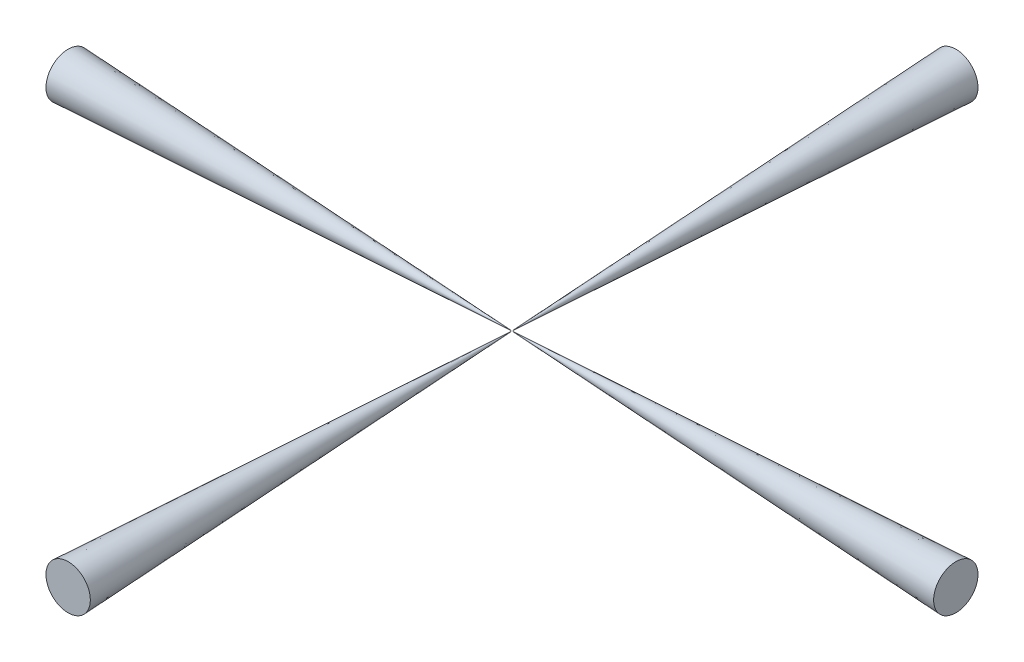
ISO-10303-21;
HEADER;
FILE_DESCRIPTION(('STEP AP214'),'2;1');
FILE_NAME('part.step','',(''),(''),'','','');
FILE_SCHEMA(('AUTOMOTIVE_DESIGN { 1 0 10303 214 1 1 1 1 }'));
ENDSEC;
DATA;
#1=APPLICATION_CONTEXT('core data for automotive mechanical design processes');
#2=APPLICATION_PROTOCOL_DEFINITION('international standard','automotive_design',2000,#1);
#3=PRODUCT_CONTEXT('',#1,'mechanical');
#4=PRODUCT('Part','Part','',(#3));
#5=PRODUCT_RELATED_PRODUCT_CATEGORY('part','',(#4));
#6=PRODUCT_DEFINITION_FORMATION('','',#4);
#7=PRODUCT_DEFINITION_CONTEXT('part definition',#1,'design');
#8=PRODUCT_DEFINITION('design','',#6,#7);
#9=PRODUCT_DEFINITION_SHAPE('','',#8);
#10=(LENGTH_UNIT() NAMED_UNIT(*) SI_UNIT(.MILLI.,.METRE.));
#11=(NAMED_UNIT(*) PLANE_ANGLE_UNIT() SI_UNIT($,.RADIAN.));
#12=(NAMED_UNIT(*) SI_UNIT($,.STERADIAN.) SOLID_ANGLE_UNIT());
#13=UNCERTAINTY_MEASURE_WITH_UNIT(LENGTH_MEASURE(1.E-05),#10,'distance_accuracy_value','');
#14=(GEOMETRIC_REPRESENTATION_CONTEXT(3) GLOBAL_UNCERTAINTY_ASSIGNED_CONTEXT((#13)) GLOBAL_UNIT_ASSIGNED_CONTEXT((#10,
#11,#12)) REPRESENTATION_CONTEXT('',''));
#15=CARTESIAN_POINT('',(0.,0.,0.));
#16=DIRECTION('',(0.,0.,1.));
#17=DIRECTION('',(1.,0.,0.));
#18=AXIS2_PLACEMENT_3D('',#15,#16,#17);
#19=CARTESIAN_POINT('',(-6.7381823802494E-13,0.,200.));
#20=DIRECTION('',(0.,0.,1.));
#21=DIRECTION('',(1.,0.,0.));
#22=AXIS2_PLACEMENT_3D('',#19,#20,#21);
#23=CONICAL_SURFACE('',#22,9.99999999999998,0.0498960513880323);
#24=CARTESIAN_POINT('',(0.,0.,0.));
#25=DIRECTION('',(0.,0.,1.));
#26=DIRECTION('',(1.,0.,0.));
#27=AXIS2_PLACEMENT_3D('',#24,#25,#26);
#28=CIRCLE('',#27,0.0125);
#29=CARTESIAN_POINT('',(0.0125000000000004,0.,0.));
#30=VERTEX_POINT('',#29);
#31=EDGE_CURVE('E48',#30,#30,#28,.T.);
#32=CARTESIAN_POINT('',(-6.7381823802494E-13,0.,200.));
#33=DIRECTION('',(0.,0.,1.));
#34=DIRECTION('',(1.,0.,0.));
#35=AXIS2_PLACEMENT_3D('',#32,#33,#34);
#36=CIRCLE('',#35,9.99999999999998);
#37=CARTESIAN_POINT('',(9.9999999999993,0.,200.));
#38=VERTEX_POINT('',#37);
#39=EDGE_CURVE('E11',#38,#38,#36,.T.);
#40=CARTESIAN_POINT('',(0.0125000000000004,0.,0.));
#41=CARTESIAN_POINT('',(0.116536458333326,0.,2.08333333333334));
#42=CARTESIAN_POINT('',(0.220572916666653,0.,4.16666666666667));
#43=CARTESIAN_POINT('',(0.428645833333305,0.,8.33333333333334));
#44=CARTESIAN_POINT('',(0.532682291666631,0.,10.4166666666667));
#45=CARTESIAN_POINT('',(0.740755208333283,0.,14.5833333333333));
#46=CARTESIAN_POINT('',(0.844791666666608,0.,16.6666666666667));
#47=CARTESIAN_POINT('',(1.05286458333326,0.,20.8333333333333));
#48=CARTESIAN_POINT('',(1.15690104166659,0.,22.9166666666667));
#49=CARTESIAN_POINT('',(1.36497395833324,0.,27.0833333333333));
#50=CARTESIAN_POINT('',(1.46901041666656,0.,29.1666666666667));
#51=CARTESIAN_POINT('',(1.67708333333322,0.,33.3333333333333));
#52=CARTESIAN_POINT('',(1.78111979166654,0.,35.4166666666667));
#53=CARTESIAN_POINT('',(1.9891927083332,0.,39.5833333333333));
#54=CARTESIAN_POINT('',(2.09322916666652,0.,41.6666666666667));
#55=CARTESIAN_POINT('',(2.30130208333317,0.,45.8333333333333));
#56=CARTESIAN_POINT('',(2.4053385416665,0.,47.9166666666667));
#57=CARTESIAN_POINT('',(2.61341145833315,0.,52.0833333333333));
#58=CARTESIAN_POINT('',(2.71744791666648,0.,54.1666666666667));
#59=CARTESIAN_POINT('',(2.92552083333313,0.,58.3333333333333));
#60=CARTESIAN_POINT('',(3.02955729166646,0.,60.4166666666667));
#61=CARTESIAN_POINT('',(3.23763020833311,0.,64.5833333333333));
#62=CARTESIAN_POINT('',(3.34166666666643,0.,66.6666666666667));
#63=CARTESIAN_POINT('',(3.54973958333309,0.,70.8333333333333));
#64=CARTESIAN_POINT('',(3.65377604166641,0.,72.9166666666667));
#65=CARTESIAN_POINT('',(3.86184895833306,0.,77.0833333333333));
#66=CARTESIAN_POINT('',(3.96588541666639,0.,79.1666666666667));
#67=CARTESIAN_POINT('',(4.17395833333304,0.,83.3333333333333));
#68=CARTESIAN_POINT('',(4.27799479166637,0.,85.4166666666667));
#69=CARTESIAN_POINT('',(4.48606770833302,0.,89.5833333333334));
#70=CARTESIAN_POINT('',(4.59010416666635,0.,91.6666666666667));
#71=CARTESIAN_POINT('',(4.798177083333,0.,95.8333333333334));
#72=CARTESIAN_POINT('',(4.90221354166632,0.,97.9166666666667));
#73=CARTESIAN_POINT('',(5.11028645833298,0.,102.083333333333));
#74=CARTESIAN_POINT('',(5.2143229166663,0.,104.166666666667));
#75=CARTESIAN_POINT('',(5.42239583333296,0.,108.333333333333));
#76=CARTESIAN_POINT('',(5.52643229166628,0.,110.416666666667));
#77=CARTESIAN_POINT('',(5.73450520833293,0.,114.583333333333));
#78=CARTESIAN_POINT('',(5.83854166666626,0.,116.666666666667));
#79=CARTESIAN_POINT('',(6.04661458333291,0.,120.833333333333));
#80=CARTESIAN_POINT('',(6.15065104166624,0.,122.916666666667));
#81=CARTESIAN_POINT('',(6.35872395833289,0.,127.083333333333));
#82=CARTESIAN_POINT('',(6.46276041666621,0.,129.166666666667));
#83=CARTESIAN_POINT('',(6.67083333333287,0.,133.333333333333));
#84=CARTESIAN_POINT('',(6.77486979166619,0.,135.416666666667));
#85=CARTESIAN_POINT('',(6.98294270833285,0.,139.583333333333));
#86=CARTESIAN_POINT('',(7.08697916666617,0.,141.666666666667));
#87=CARTESIAN_POINT('',(7.29505208333282,0.,145.833333333333));
#88=CARTESIAN_POINT('',(7.39908854166615,0.,147.916666666667));
#89=CARTESIAN_POINT('',(7.6071614583328,0.,152.083333333333));
#90=CARTESIAN_POINT('',(7.71119791666613,0.,154.166666666667));
#91=CARTESIAN_POINT('',(7.91927083333278,0.,158.333333333333));
#92=CARTESIAN_POINT('',(8.02330729166611,0.,160.416666666667));
#93=CARTESIAN_POINT('',(8.23138020833276,0.,164.583333333333));
#94=CARTESIAN_POINT('',(8.33541666666609,0.,166.666666666667));
#95=CARTESIAN_POINT('',(8.54348958333274,0.,170.833333333333));
#96=CARTESIAN_POINT('',(8.64752604166607,0.,172.916666666667));
#97=CARTESIAN_POINT('',(8.85559895833272,0.,177.083333333333));
#98=CARTESIAN_POINT('',(8.95963541666604,0.,179.166666666667));
#99=CARTESIAN_POINT('',(9.16770833333269,0.,183.333333333333));
#100=CARTESIAN_POINT('',(9.27174479166602,0.,185.416666666667));
#101=CARTESIAN_POINT('',(9.47981770833267,0.,189.583333333333));
#102=CARTESIAN_POINT('',(9.583854166666,0.,191.666666666667));
#103=CARTESIAN_POINT('',(9.79192708333265,0.,195.833333333333));
#104=CARTESIAN_POINT('',(9.89596354166598,0.,197.916666666667));
#105=CARTESIAN_POINT('',(9.9999999999993,0.,200.));
#106=B_SPLINE_CURVE_WITH_KNOTS('',3,(#40,#41,#42,#43,#44,#45,#46,#47,#48,#49,#50,#51,#52,#53,
#54,#55,#56,#57,#58,#59,#60,#61,#62,#63,#64,#65,#66,#67,#68,#69,#70,#71,#72,#73,#74,#75,#76,#77,
#78,#79,#80,#81,#82,#83,#84,#85,#86,#87,#88,#89,#90,#91,#92,#93,#94,#95,#96,#97,#98,#99,#100,
#101,#102,#103,#104,#105),.UNSPECIFIED.,.F.,.F.,(4,2,2,2,2,2,2,2,2,2,2,2,2,2,2,2,2,2,2,2,2,2,2,
2,2,2,2,2,2,2,2,2,4),(0.,6.25778812856132,12.5155762571226,18.7733643856839,25.0311525142452,
31.2889406428066,37.5467287713679,43.8045168999292,50.0623050284905,56.3200931570518,
62.5778812856131,68.8356694141744,75.0934575427357,81.351245671297,87.6090337998584,
93.8668219284197,100.124610056981,106.382398185542,112.640186314104,118.897974442665,
125.155762571226,131.413550699788,137.671338828349,143.92912695691,150.186915085471,
156.444703214033,162.702491342594,168.960279471155,175.218067599717,181.475855728278,
187.733643856839,193.991431985401,200.249220113962),.UNSPECIFIED.);
#107=EDGE_CURVE('BSEAM42',#30,#38,#106,.T.);
#108=ORIENTED_EDGE('',*,*,#31,.T.);
#109=ORIENTED_EDGE('',*,*,#39,.F.);
#110=ORIENTED_EDGE('',*,*,#107,.T.);
#111=ORIENTED_EDGE('',*,*,#107,.F.);
#112=EDGE_LOOP('',(#108,#110,#109,#111));
#113=FACE_BOUND('',#112,.T.);
#114=ADVANCED_FACE('F42',(#113),#23,.T.);
#115=CARTESIAN_POINT('',(9.9999999999993,0.,200.));
#116=DIRECTION('',(0.,0.,1.));
#117=DIRECTION('',(1.,0.,0.));
#118=AXIS2_PLACEMENT_3D('',#115,#116,#117);
#119=PLANE('',#118);
#120=ORIENTED_EDGE('',*,*,#39,.T.);
#121=EDGE_LOOP('',(#120));
#122=FACE_BOUND('',#121,.T.);
#123=ADVANCED_FACE('F67',(#122),#119,.T.);
#124=CARTESIAN_POINT('',(6.7381823802494E-13,0.,-200.));
#125=DIRECTION('',(0.,0.,-1.));
#126=DIRECTION('',(1.,0.,0.));
#127=AXIS2_PLACEMENT_3D('',#124,#125,#126);
#128=CONICAL_SURFACE('',#127,9.99999999999998,0.0498960513880323);
#129=CARTESIAN_POINT('',(6.7381823802494E-13,0.,-200.));
#130=DIRECTION('',(0.,0.,1.));
#131=DIRECTION('',(1.,0.,0.));
#132=AXIS2_PLACEMENT_3D('',#129,#130,#131);
#133=CIRCLE('',#132,9.99999999999998);
#134=CARTESIAN_POINT('',(10.0000000000006,0.,-200.));
#135=VERTEX_POINT('',#134);
#136=EDGE_CURVE('E52',#135,#135,#133,.T.);
#137=CARTESIAN_POINT('',(0.0125000000000004,0.,0.));
#138=CARTESIAN_POINT('',(0.116536458333341,0.,-2.08333333333334));
#139=CARTESIAN_POINT('',(0.220572916666681,0.,-4.16666666666667));
#140=CARTESIAN_POINT('',(0.428645833333361,0.,-8.33333333333334));
#141=CARTESIAN_POINT('',(0.532682291666701,0.,-10.4166666666667));
#142=CARTESIAN_POINT('',(0.740755208333381,0.,-14.5833333333333));
#143=CARTESIAN_POINT('',(0.844791666666721,0.,-16.6666666666667));
#144=CARTESIAN_POINT('',(1.0528645833334,0.,-20.8333333333333));
#145=CARTESIAN_POINT('',(1.15690104166674,0.,-22.9166666666667));
#146=CARTESIAN_POINT('',(1.36497395833342,0.,-27.0833333333333));
#147=CARTESIAN_POINT('',(1.46901041666676,0.,-29.1666666666667));
#148=CARTESIAN_POINT('',(1.67708333333344,0.,-33.3333333333333));
#149=CARTESIAN_POINT('',(1.78111979166678,0.,-35.4166666666667));
#150=CARTESIAN_POINT('',(1.98919270833346,0.,-39.5833333333333));
#151=CARTESIAN_POINT('',(2.0932291666668,0.,-41.6666666666667));
#152=CARTESIAN_POINT('',(2.30130208333348,0.,-45.8333333333333));
#153=CARTESIAN_POINT('',(2.40533854166682,0.,-47.9166666666667));
#154=CARTESIAN_POINT('',(2.6134114583335,0.,-52.0833333333333));
#155=CARTESIAN_POINT('',(2.71744791666684,0.,-54.1666666666667));
#156=CARTESIAN_POINT('',(2.92552083333352,0.,-58.3333333333333));
#157=CARTESIAN_POINT('',(3.02955729166686,0.,-60.4166666666667));
#158=CARTESIAN_POINT('',(3.23763020833354,0.,-64.5833333333333));
#159=CARTESIAN_POINT('',(3.34166666666688,0.,-66.6666666666667));
#160=CARTESIAN_POINT('',(3.54973958333356,0.,-70.8333333333333));
#161=CARTESIAN_POINT('',(3.6537760416669,0.,-72.9166666666667));
#162=CARTESIAN_POINT('',(3.86184895833358,0.,-77.0833333333333));
#163=CARTESIAN_POINT('',(3.96588541666692,0.,-79.1666666666667));
#164=CARTESIAN_POINT('',(4.1739583333336,0.,-83.3333333333333));
#165=CARTESIAN_POINT('',(4.27799479166694,0.,-85.4166666666667));
#166=CARTESIAN_POINT('',(4.48606770833362,0.,-89.5833333333333));
#167=CARTESIAN_POINT('',(4.59010416666696,0.,-91.6666666666666));
#168=CARTESIAN_POINT('',(4.79817708333364,0.,-95.8333333333333));
#169=CARTESIAN_POINT('',(4.90221354166699,0.,-97.9166666666666));
#170=CARTESIAN_POINT('',(5.11028645833367,0.,-102.083333333333));
#171=CARTESIAN_POINT('',(5.21432291666701,0.,-104.166666666667));
#172=CARTESIAN_POINT('',(5.42239583333369,0.,-108.333333333333));
#173=CARTESIAN_POINT('',(5.52643229166703,0.,-110.416666666667));
#174=CARTESIAN_POINT('',(5.73450520833371,0.,-114.583333333333));
#175=CARTESIAN_POINT('',(5.83854166666705,0.,-116.666666666667));
#176=CARTESIAN_POINT('',(6.04661458333373,0.,-120.833333333333));
#177=CARTESIAN_POINT('',(6.15065104166707,0.,-122.916666666667));
#178=CARTESIAN_POINT('',(6.35872395833375,0.,-127.083333333333));
#179=CARTESIAN_POINT('',(6.46276041666709,0.,-129.166666666667));
#180=CARTESIAN_POINT('',(6.67083333333377,0.,-133.333333333333));
#181=CARTESIAN_POINT('',(6.77486979166711,0.,-135.416666666667));
#182=CARTESIAN_POINT('',(6.98294270833379,0.,-139.583333333333));
#183=CARTESIAN_POINT('',(7.08697916666713,0.,-141.666666666667));
#184=CARTESIAN_POINT('',(7.29505208333381,0.,-145.833333333333));
#185=CARTESIAN_POINT('',(7.39908854166715,0.,-147.916666666667));
#186=CARTESIAN_POINT('',(7.60716145833383,0.,-152.083333333333));
#187=CARTESIAN_POINT('',(7.71119791666717,0.,-154.166666666667));
#188=CARTESIAN_POINT('',(7.91927083333385,0.,-158.333333333333));
#189=CARTESIAN_POINT('',(8.02330729166719,0.,-160.416666666667));
#190=CARTESIAN_POINT('',(8.23138020833387,0.,-164.583333333333));
#191=CARTESIAN_POINT('',(8.33541666666721,0.,-166.666666666667));
#192=CARTESIAN_POINT('',(8.54348958333389,0.,-170.833333333333));
#193=CARTESIAN_POINT('',(8.64752604166723,0.,-172.916666666667));
#194=CARTESIAN_POINT('',(8.85559895833391,0.,-177.083333333333));
#195=CARTESIAN_POINT('',(8.95963541666725,0.,-179.166666666667));
#196=CARTESIAN_POINT('',(9.16770833333393,0.,-183.333333333333));
#197=CARTESIAN_POINT('',(9.27174479166727,0.,-185.416666666667));
#198=CARTESIAN_POINT('',(9.47981770833395,0.,-189.583333333333));
#199=CARTESIAN_POINT('',(9.58385416666729,0.,-191.666666666667));
#200=CARTESIAN_POINT('',(9.79192708333397,0.,-195.833333333333));
#201=CARTESIAN_POINT('',(9.89596354166731,0.,-197.916666666667));
#202=CARTESIAN_POINT('',(10.0000000000006,0.,-200.));
#203=B_SPLINE_CURVE_WITH_KNOTS('',3,(#137,#138,#139,#140,#141,#142,#143,#144,#145,#146,#147,
#148,#149,#150,#151,#152,#153,#154,#155,#156,#157,#158,#159,#160,#161,#162,#163,#164,#165,#166,
#167,#168,#169,#170,#171,#172,#173,#174,#175,#176,#177,#178,#179,#180,#181,#182,#183,#184,#185,
#186,#187,#188,#189,#190,#191,#192,#193,#194,#195,#196,#197,#198,#199,#200,#201,#202),
.UNSPECIFIED.,.F.,.F.,(4,2,2,2,2,2,2,2,2,2,2,2,2,2,2,2,2,2,2,2,2,2,2,2,2,2,2,2,2,2,2,2,4),(0.,
6.25778812856132,12.5155762571226,18.7733643856839,25.0311525142452,31.2889406428066,
37.5467287713679,43.8045168999292,50.0623050284905,56.3200931570518,62.5778812856131,
68.8356694141745,75.0934575427358,81.3512456712971,87.6090337998584,93.8668219284197,
100.124610056981,106.382398185542,112.640186314104,118.897974442665,125.155762571226,
131.413550699788,137.671338828349,143.92912695691,150.186915085471,156.444703214033,
162.702491342594,168.960279471155,175.218067599717,181.475855728278,187.733643856839,
193.991431985401,200.249220113962),.UNSPECIFIED.);
#204=EDGE_CURVE('BSEAM59',#30,#135,#203,.T.);
#205=ORIENTED_EDGE('',*,*,#31,.F.);
#206=ORIENTED_EDGE('',*,*,#136,.T.);
#207=ORIENTED_EDGE('',*,*,#204,.T.);
#208=ORIENTED_EDGE('',*,*,#204,.F.);
#209=EDGE_LOOP('',(#205,#207,#206,#208));
#210=FACE_BOUND('',#209,.T.);
#211=ADVANCED_FACE('F59',(#210),#128,.T.);
#212=CARTESIAN_POINT('',(10.0000000000007,0.,-200.));
#213=DIRECTION('',(0.,0.,-1.));
#214=DIRECTION('',(1.,0.,0.));
#215=AXIS2_PLACEMENT_3D('',#212,#213,#214);
#216=PLANE('',#215);
#217=ORIENTED_EDGE('',*,*,#136,.F.);
#218=EDGE_LOOP('',(#217));
#219=FACE_BOUND('',#218,.T.);
#220=ADVANCED_FACE('F61',(#219),#216,.T.);
#221=CLOSED_SHELL('',(#114,#123,#211,#220));
#222=MANIFOLD_SOLID_BREP('B2',#221);
#223=CARTESIAN_POINT('',(200.,0.,0.));
#224=DIRECTION('',(1.,0.,0.));
#225=DIRECTION('',(0.,0.,-1.));
#226=AXIS2_PLACEMENT_3D('',#223,#224,#225);
#227=CONICAL_SURFACE('',#226,9.99999999999998,0.0498960513880323);
#228=CARTESIAN_POINT('',(0.,0.,0.));
#229=DIRECTION('',(1.,0.,0.));
#230=DIRECTION('',(0.,0.,-1.));
#231=AXIS2_PLACEMENT_3D('',#228,#229,#230);
#232=CIRCLE('',#231,0.0125);
#233=CARTESIAN_POINT('',(0.,0.,-0.0125000000000004));
#234=VERTEX_POINT('',#233);
#235=EDGE_CURVE('E103',#234,#234,#232,.T.);
#236=CARTESIAN_POINT('',(200.,0.,0.));
#237=DIRECTION('',(1.,0.,0.));
#238=DIRECTION('',(0.,0.,-1.));
#239=AXIS2_PLACEMENT_3D('',#236,#237,#238);
#240=CIRCLE('',#239,9.99999999999998);
#241=CARTESIAN_POINT('',(200.,0.,-10.));
#242=VERTEX_POINT('',#241);
#243=EDGE_CURVE('E41',#242,#242,#240,.T.);
#244=CARTESIAN_POINT('',(0.,0.,-0.0125000000000004));
#245=CARTESIAN_POINT('',(2.08333333333333,0.,-0.116536458333334));
#246=CARTESIAN_POINT('',(4.16666666666667,0.,-0.220572916666667));
#247=CARTESIAN_POINT('',(8.33333333333334,0.,-0.428645833333334));
#248=CARTESIAN_POINT('',(10.4166666666667,0.,-0.532682291666667));
#249=CARTESIAN_POINT('',(14.5833333333333,0.,-0.740755208333334));
#250=CARTESIAN_POINT('',(16.6666666666667,0.,-0.844791666666666));
#251=CARTESIAN_POINT('',(20.8333333333333,0.,-1.05286458333333));
#252=CARTESIAN_POINT('',(22.9166666666667,0.,-1.15690104166667));
#253=CARTESIAN_POINT('',(27.0833333333333,0.,-1.36497395833333));
#254=CARTESIAN_POINT('',(29.1666666666667,0.,-1.46901041666667));
#255=CARTESIAN_POINT('',(33.3333333333333,0.,-1.67708333333333));
#256=CARTESIAN_POINT('',(35.4166666666667,0.,-1.78111979166667));
#257=CARTESIAN_POINT('',(39.5833333333333,0.,-1.98919270833333));
#258=CARTESIAN_POINT('',(41.6666666666667,0.,-2.09322916666667));
#259=CARTESIAN_POINT('',(45.8333333333333,0.,-2.30130208333333));
#260=CARTESIAN_POINT('',(47.9166666666667,0.,-2.40533854166667));
#261=CARTESIAN_POINT('',(52.0833333333333,0.,-2.61341145833333));
#262=CARTESIAN_POINT('',(54.1666666666667,0.,-2.71744791666667));
#263=CARTESIAN_POINT('',(58.3333333333333,0.,-2.92552083333333));
#264=CARTESIAN_POINT('',(60.4166666666667,0.,-3.02955729166667));
#265=CARTESIAN_POINT('',(64.5833333333333,0.,-3.23763020833333));
#266=CARTESIAN_POINT('',(66.6666666666667,0.,-3.34166666666667));
#267=CARTESIAN_POINT('',(70.8333333333333,0.,-3.54973958333333));
#268=CARTESIAN_POINT('',(72.9166666666667,0.,-3.65377604166667));
#269=CARTESIAN_POINT('',(77.0833333333333,0.,-3.86184895833333));
#270=CARTESIAN_POINT('',(79.1666666666667,0.,-3.96588541666667));
#271=CARTESIAN_POINT('',(83.3333333333333,0.,-4.17395833333333));
#272=CARTESIAN_POINT('',(85.4166666666667,0.,-4.27799479166667));
#273=CARTESIAN_POINT('',(89.5833333333333,0.,-4.48606770833333));
#274=CARTESIAN_POINT('',(91.6666666666667,0.,-4.59010416666667));
#275=CARTESIAN_POINT('',(95.8333333333333,0.,-4.79817708333333));
#276=CARTESIAN_POINT('',(97.9166666666667,0.,-4.90221354166667));
#277=CARTESIAN_POINT('',(102.083333333333,0.,-5.11028645833333));
#278=CARTESIAN_POINT('',(104.166666666667,0.,-5.21432291666667));
#279=CARTESIAN_POINT('',(108.333333333333,0.,-5.42239583333333));
#280=CARTESIAN_POINT('',(110.416666666667,0.,-5.52643229166667));
#281=CARTESIAN_POINT('',(114.583333333333,0.,-5.73450520833333));
#282=CARTESIAN_POINT('',(116.666666666667,0.,-5.83854166666667));
#283=CARTESIAN_POINT('',(120.833333333333,0.,-6.04661458333333));
#284=CARTESIAN_POINT('',(122.916666666667,0.,-6.15065104166667));
#285=CARTESIAN_POINT('',(127.083333333333,0.,-6.35872395833333));
#286=CARTESIAN_POINT('',(129.166666666667,0.,-6.46276041666667));
#287=CARTESIAN_POINT('',(133.333333333333,0.,-6.67083333333333));
#288=CARTESIAN_POINT('',(135.416666666667,0.,-6.77486979166667));
#289=CARTESIAN_POINT('',(139.583333333333,0.,-6.98294270833333));
#290=CARTESIAN_POINT('',(141.666666666667,0.,-7.08697916666667));
#291=CARTESIAN_POINT('',(145.833333333333,0.,-7.29505208333333));
#292=CARTESIAN_POINT('',(147.916666666667,0.,-7.39908854166667));
#293=CARTESIAN_POINT('',(152.083333333333,0.,-7.60716145833333));
#294=CARTESIAN_POINT('',(154.166666666667,0.,-7.71119791666667));
#295=CARTESIAN_POINT('',(158.333333333333,0.,-7.91927083333333));
#296=CARTESIAN_POINT('',(160.416666666667,0.,-8.02330729166667));
#297=CARTESIAN_POINT('',(164.583333333333,0.,-8.23138020833333));
#298=CARTESIAN_POINT('',(166.666666666667,0.,-8.33541666666667));
#299=CARTESIAN_POINT('',(170.833333333333,0.,-8.54348958333333));
#300=CARTESIAN_POINT('',(172.916666666667,0.,-8.64752604166667));
#301=CARTESIAN_POINT('',(177.083333333333,0.,-8.85559895833333));
#302=CARTESIAN_POINT('',(179.166666666667,0.,-8.95963541666667));
#303=CARTESIAN_POINT('',(183.333333333333,0.,-9.16770833333334));
#304=CARTESIAN_POINT('',(185.416666666667,0.,-9.27174479166667));
#305=CARTESIAN_POINT('',(189.583333333333,0.,-9.47981770833333));
#306=CARTESIAN_POINT('',(191.666666666667,0.,-9.58385416666667));
#307=CARTESIAN_POINT('',(195.833333333333,0.,-9.79192708333333));
#308=CARTESIAN_POINT('',(197.916666666667,0.,-9.89596354166667));
#309=CARTESIAN_POINT('',(200.,0.,-10.));
#310=B_SPLINE_CURVE_WITH_KNOTS('',3,(#244,#245,#246,#247,#248,#249,#250,#251,#252,#253,#254,
#255,#256,#257,#258,#259,#260,#261,#262,#263,#264,#265,#266,#267,#268,#269,#270,#271,#272,#273,
#274,#275,#276,#277,#278,#279,#280,#281,#282,#283,#284,#285,#286,#287,#288,#289,#290,#291,#292,
#293,#294,#295,#296,#297,#298,#299,#300,#301,#302,#303,#304,#305,#306,#307,#308,#309),
.UNSPECIFIED.,.F.,.F.,(4,2,2,2,2,2,2,2,2,2,2,2,2,2,2,2,2,2,2,2,2,2,2,2,2,2,2,2,2,2,2,2,4),(0.,
6.25778812856132,12.5155762571226,18.7733643856839,25.0311525142452,31.2889406428066,
37.5467287713679,43.8045168999292,50.0623050284905,56.3200931570518,62.5778812856131,
68.8356694141744,75.0934575427357,81.351245671297,87.6090337998584,93.8668219284197,
100.124610056981,106.382398185542,112.640186314104,118.897974442665,125.155762571226,
131.413550699788,137.671338828349,143.92912695691,150.186915085471,156.444703214033,
162.702491342594,168.960279471155,175.218067599717,181.475855728278,187.733643856839,
193.991431985401,200.249220113962),.UNSPECIFIED.);
#311=EDGE_CURVE('BSEAM97',#234,#242,#310,.T.);
#312=ORIENTED_EDGE('',*,*,#235,.T.);
#313=ORIENTED_EDGE('',*,*,#243,.F.);
#314=ORIENTED_EDGE('',*,*,#311,.T.);
#315=ORIENTED_EDGE('',*,*,#311,.F.);
#316=EDGE_LOOP('',(#312,#314,#313,#315));
#317=FACE_BOUND('',#316,.T.);
#318=ADVANCED_FACE('F97',(#317),#227,.T.);
#319=CARTESIAN_POINT('',(200.,0.,-10.));
#320=DIRECTION('',(1.,0.,0.));
#321=DIRECTION('',(0.,0.,-1.));
#322=AXIS2_PLACEMENT_3D('',#319,#320,#321);
#323=PLANE('',#322);
#324=ORIENTED_EDGE('',*,*,#243,.T.);
#325=EDGE_LOOP('',(#324));
#326=FACE_BOUND('',#325,.T.);
#327=ADVANCED_FACE('F122',(#326),#323,.T.);
#328=CARTESIAN_POINT('',(-200.,0.,0.));
#329=DIRECTION('',(-1.,0.,0.));
#330=DIRECTION('',(0.,0.,-1.));
#331=AXIS2_PLACEMENT_3D('',#328,#329,#330);
#332=CONICAL_SURFACE('',#331,9.99999999999998,0.0498960513880323);
#333=CARTESIAN_POINT('',(-200.,0.,0.));
#334=DIRECTION('',(1.,0.,0.));
#335=DIRECTION('',(0.,0.,-1.));
#336=AXIS2_PLACEMENT_3D('',#333,#334,#335);
#337=CIRCLE('',#336,9.99999999999998);
#338=CARTESIAN_POINT('',(-200.,0.,-9.99999999999995));
#339=VERTEX_POINT('',#338);
#340=EDGE_CURVE('E107',#339,#339,#337,.T.);
#341=CARTESIAN_POINT('',(0.,0.,-0.0125000000000004));
#342=CARTESIAN_POINT('',(-2.08333333333333,0.,-0.116536458333333));
#343=CARTESIAN_POINT('',(-4.16666666666667,0.,-0.220572916666666));
#344=CARTESIAN_POINT('',(-8.33333333333334,0.,-0.428645833333332));
#345=CARTESIAN_POINT('',(-10.4166666666667,0.,-0.532682291666665));
#346=CARTESIAN_POINT('',(-14.5833333333333,0.,-0.74075520833333));
#347=CARTESIAN_POINT('',(-16.6666666666667,0.,-0.844791666666662));
#348=CARTESIAN_POINT('',(-20.8333333333333,0.,-1.05286458333333));
#349=CARTESIAN_POINT('',(-22.9166666666667,0.,-1.15690104166666));
#350=CARTESIAN_POINT('',(-27.0833333333333,0.,-1.36497395833333));
#351=CARTESIAN_POINT('',(-29.1666666666667,0.,-1.46901041666666));
#352=CARTESIAN_POINT('',(-33.3333333333333,0.,-1.67708333333332));
#353=CARTESIAN_POINT('',(-35.4166666666667,0.,-1.78111979166666));
#354=CARTESIAN_POINT('',(-39.5833333333333,0.,-1.98919270833332));
#355=CARTESIAN_POINT('',(-41.6666666666667,0.,-2.09322916666666));
#356=CARTESIAN_POINT('',(-45.8333333333333,0.,-2.30130208333332));
#357=CARTESIAN_POINT('',(-47.9166666666667,0.,-2.40533854166665));
#358=CARTESIAN_POINT('',(-52.0833333333333,0.,-2.61341145833332));
#359=CARTESIAN_POINT('',(-54.1666666666667,0.,-2.71744791666665));
#360=CARTESIAN_POINT('',(-58.3333333333333,0.,-2.92552083333332));
#361=CARTESIAN_POINT('',(-60.4166666666667,0.,-3.02955729166665));
#362=CARTESIAN_POINT('',(-64.5833333333333,0.,-3.23763020833332));
#363=CARTESIAN_POINT('',(-66.6666666666667,0.,-3.34166666666665));
#364=CARTESIAN_POINT('',(-70.8333333333333,0.,-3.54973958333332));
#365=CARTESIAN_POINT('',(-72.9166666666667,0.,-3.65377604166665));
#366=CARTESIAN_POINT('',(-77.0833333333333,0.,-3.86184895833331));
#367=CARTESIAN_POINT('',(-79.1666666666667,0.,-3.96588541666665));
#368=CARTESIAN_POINT('',(-83.3333333333333,0.,-4.17395833333331));
#369=CARTESIAN_POINT('',(-85.4166666666667,0.,-4.27799479166665));
#370=CARTESIAN_POINT('',(-89.5833333333333,0.,-4.48606770833331));
#371=CARTESIAN_POINT('',(-91.6666666666667,0.,-4.59010416666664));
#372=CARTESIAN_POINT('',(-95.8333333333333,0.,-4.79817708333331));
#373=CARTESIAN_POINT('',(-97.9166666666667,0.,-4.90221354166664));
#374=CARTESIAN_POINT('',(-102.083333333333,0.,-5.11028645833331));
#375=CARTESIAN_POINT('',(-104.166666666667,0.,-5.21432291666664));
#376=CARTESIAN_POINT('',(-108.333333333333,0.,-5.42239583333331));
#377=CARTESIAN_POINT('',(-110.416666666667,0.,-5.52643229166664));
#378=CARTESIAN_POINT('',(-114.583333333333,0.,-5.73450520833331));
#379=CARTESIAN_POINT('',(-116.666666666667,0.,-5.83854166666664));
#380=CARTESIAN_POINT('',(-120.833333333333,0.,-6.0466145833333));
#381=CARTESIAN_POINT('',(-122.916666666667,0.,-6.15065104166664));
#382=CARTESIAN_POINT('',(-127.083333333333,0.,-6.3587239583333));
#383=CARTESIAN_POINT('',(-129.166666666667,0.,-6.46276041666663));
#384=CARTESIAN_POINT('',(-133.333333333333,0.,-6.6708333333333));
#385=CARTESIAN_POINT('',(-135.416666666667,0.,-6.77486979166663));
#386=CARTESIAN_POINT('',(-139.583333333333,0.,-6.9829427083333));
#387=CARTESIAN_POINT('',(-141.666666666667,0.,-7.08697916666663));
#388=CARTESIAN_POINT('',(-145.833333333333,0.,-7.2950520833333));
#389=CARTESIAN_POINT('',(-147.916666666667,0.,-7.39908854166663));
#390=CARTESIAN_POINT('',(-152.083333333333,0.,-7.6071614583333));
#391=CARTESIAN_POINT('',(-154.166666666667,0.,-7.71119791666663));
#392=CARTESIAN_POINT('',(-158.333333333333,0.,-7.91927083333329));
#393=CARTESIAN_POINT('',(-160.416666666667,0.,-8.02330729166663));
#394=CARTESIAN_POINT('',(-164.583333333333,0.,-8.2313802083333));
#395=CARTESIAN_POINT('',(-166.666666666667,0.,-8.33541666666663));
#396=CARTESIAN_POINT('',(-170.833333333333,0.,-8.54348958333329));
#397=CARTESIAN_POINT('',(-172.916666666667,0.,-8.64752604166663));
#398=CARTESIAN_POINT('',(-177.083333333333,0.,-8.85559895833329));
#399=CARTESIAN_POINT('',(-179.166666666667,0.,-8.95963541666662));
#400=CARTESIAN_POINT('',(-183.333333333333,0.,-9.16770833333329));
#401=CARTESIAN_POINT('',(-185.416666666667,0.,-9.27174479166662));
#402=CARTESIAN_POINT('',(-189.583333333333,0.,-9.47981770833329));
#403=CARTESIAN_POINT('',(-191.666666666667,0.,-9.58385416666662));
#404=CARTESIAN_POINT('',(-195.833333333333,0.,-9.79192708333328));
#405=CARTESIAN_POINT('',(-197.916666666667,0.,-9.89596354166662));
#406=CARTESIAN_POINT('',(-200.,0.,-9.99999999999995));
#407=B_SPLINE_CURVE_WITH_KNOTS('',3,(#341,#342,#343,#344,#345,#346,#347,#348,#349,#350,#351,
#352,#353,#354,#355,#356,#357,#358,#359,#360,#361,#362,#363,#364,#365,#366,#367,#368,#369,#370,
#371,#372,#373,#374,#375,#376,#377,#378,#379,#380,#381,#382,#383,#384,#385,#386,#387,#388,#389,
#390,#391,#392,#393,#394,#395,#396,#397,#398,#399,#400,#401,#402,#403,#404,#405,#406),
.UNSPECIFIED.,.F.,.F.,(4,2,2,2,2,2,2,2,2,2,2,2,2,2,2,2,2,2,2,2,2,2,2,2,2,2,2,2,2,2,2,2,4),(0.,
6.25778812856132,12.5155762571226,18.7733643856839,25.0311525142452,31.2889406428066,
37.5467287713679,43.8045168999292,50.0623050284905,56.3200931570518,62.5778812856131,
68.8356694141744,75.0934575427357,81.351245671297,87.6090337998584,93.8668219284197,
100.124610056981,106.382398185542,112.640186314104,118.897974442665,125.155762571226,
131.413550699788,137.671338828349,143.92912695691,150.186915085471,156.444703214033,
162.702491342594,168.960279471155,175.218067599717,181.475855728278,187.733643856839,
193.991431985401,200.249220113962),.UNSPECIFIED.);
#408=EDGE_CURVE('BSEAM114',#234,#339,#407,.T.);
#409=ORIENTED_EDGE('',*,*,#235,.F.);
#410=ORIENTED_EDGE('',*,*,#340,.T.);
#411=ORIENTED_EDGE('',*,*,#408,.T.);
#412=ORIENTED_EDGE('',*,*,#408,.F.);
#413=EDGE_LOOP('',(#409,#411,#410,#412));
#414=FACE_BOUND('',#413,.T.);
#415=ADVANCED_FACE('F114',(#414),#332,.T.);
#416=CARTESIAN_POINT('',(-200.,0.,-9.99999999999995));
#417=DIRECTION('',(-1.,0.,0.));
#418=DIRECTION('',(0.,0.,-1.));
#419=AXIS2_PLACEMENT_3D('',#416,#417,#418);
#420=PLANE('',#419);
#421=ORIENTED_EDGE('',*,*,#340,.F.);
#422=EDGE_LOOP('',(#421));
#423=FACE_BOUND('',#422,.T.);
#424=ADVANCED_FACE('F116',(#423),#420,.T.);
#425=CLOSED_SHELL('',(#318,#327,#415,#424));
#426=MANIFOLD_SOLID_BREP('B6',#425);
#427=ADVANCED_BREP_SHAPE_REPRESENTATION('',(#18,#222,#426),#14);
#428=SHAPE_DEFINITION_REPRESENTATION(#9,#427);
ENDSEC;
END-ISO-10303-21;
